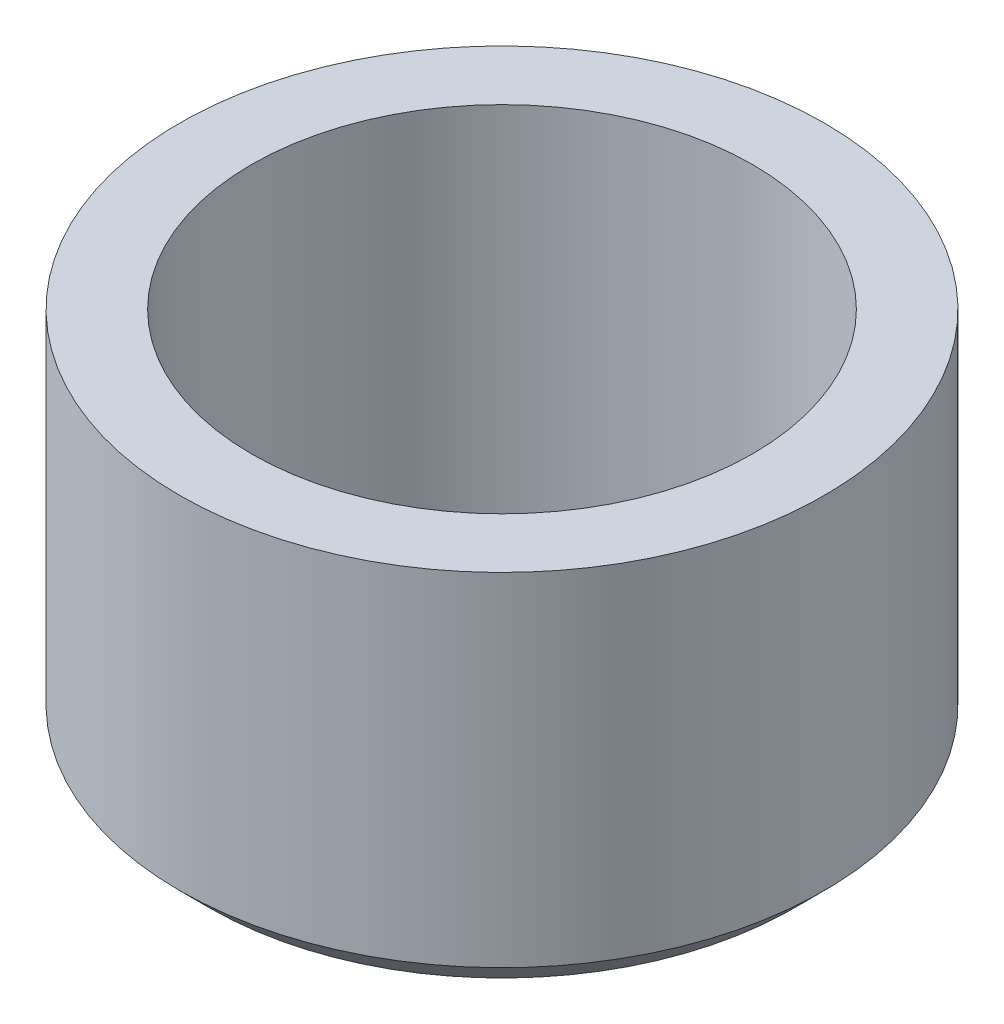
ISO-10303-21;
HEADER;
FILE_DESCRIPTION(('STEP AP214'),'2;1');
FILE_NAME('part.step','',(''),(''),'','','');
FILE_SCHEMA(('AUTOMOTIVE_DESIGN { 1 0 10303 214 1 1 1 1 }'));
ENDSEC;
DATA;
#1=APPLICATION_CONTEXT('core data for automotive mechanical design processes');
#2=APPLICATION_PROTOCOL_DEFINITION('international standard','automotive_design',2000,#1);
#3=PRODUCT_CONTEXT('',#1,'mechanical');
#4=PRODUCT('Part','Part','',(#3));
#5=PRODUCT_RELATED_PRODUCT_CATEGORY('part','',(#4));
#6=PRODUCT_DEFINITION_FORMATION('','',#4);
#7=PRODUCT_DEFINITION_CONTEXT('part definition',#1,'design');
#8=PRODUCT_DEFINITION('design','',#6,#7);
#9=PRODUCT_DEFINITION_SHAPE('','',#8);
#10=(LENGTH_UNIT() NAMED_UNIT(*) SI_UNIT(.MILLI.,.METRE.));
#11=(NAMED_UNIT(*) PLANE_ANGLE_UNIT() SI_UNIT($,.RADIAN.));
#12=(NAMED_UNIT(*) SI_UNIT($,.STERADIAN.) SOLID_ANGLE_UNIT());
#13=UNCERTAINTY_MEASURE_WITH_UNIT(LENGTH_MEASURE(1.E-05),#10,'distance_accuracy_value','');
#14=(GEOMETRIC_REPRESENTATION_CONTEXT(3) GLOBAL_UNCERTAINTY_ASSIGNED_CONTEXT((#13)) GLOBAL_UNIT_ASSIGNED_CONTEXT((#10,
#11,#12)) REPRESENTATION_CONTEXT('',''));
#15=CARTESIAN_POINT('',(0.,0.,0.));
#16=DIRECTION('',(0.,0.,1.));
#17=DIRECTION('',(1.,0.,0.));
#18=AXIS2_PLACEMENT_3D('',#15,#16,#17);
#19=CARTESIAN_POINT('',(-5.275,6.1,0.));
#20=DIRECTION('',(0.,1.,0.));
#21=DIRECTION('',(0.,0.,1.));
#22=AXIS2_PLACEMENT_3D('',#19,#20,#21);
#23=PLANE('',#22);
#24=CARTESIAN_POINT('',(0.,6.1,0.));
#25=DIRECTION('',(0.,1.,0.));
#26=DIRECTION('',(0.,0.,1.));
#27=AXIS2_PLACEMENT_3D('',#24,#25,#26);
#28=CIRCLE('',#27,5.275);
#29=CARTESIAN_POINT('',(0.,6.1,5.275));
#30=VERTEX_POINT('',#29);
#31=EDGE_CURVE('E56',#30,#30,#28,.T.);
#32=ORIENTED_EDGE('',*,*,#31,.T.);
#33=EDGE_LOOP('',(#32));
#34=FACE_BOUND('',#33,.T.);
#35=CARTESIAN_POINT('',(0.,6.1,0.));
#36=DIRECTION('',(0.,1.,0.));
#37=DIRECTION('',(0.,0.,1.));
#38=AXIS2_PLACEMENT_3D('',#35,#36,#37);
#39=CIRCLE('',#38,4.1);
#40=CARTESIAN_POINT('',(0.,6.1,4.1));
#41=VERTEX_POINT('',#40);
#42=EDGE_CURVE('E68',#41,#41,#39,.T.);
#43=ORIENTED_EDGE('',*,*,#42,.F.);
#44=EDGE_LOOP('',(#43));
#45=FACE_BOUND('',#44,.T.);
#46=ADVANCED_FACE('F41',(#34,#45),#23,.T.);
#47=CARTESIAN_POINT('',(0.,36.0573770491804,0.));
#48=DIRECTION('',(0.,1.,0.));
#49=DIRECTION('',(0.,0.,1.));
#50=AXIS2_PLACEMENT_3D('',#47,#48,#49);
#51=CYLINDRICAL_SURFACE('',#50,5.275);
#52=CARTESIAN_POINT('',(0.,0.5,0.));
#53=DIRECTION('',(0.,-1.,0.));
#54=DIRECTION('',(0.,0.,-1.));
#55=AXIS2_PLACEMENT_3D('',#52,#53,#54);
#56=CIRCLE('',#55,5.275);
#57=CARTESIAN_POINT('',(0.,0.5,-5.275));
#58=VERTEX_POINT('',#57);
#59=EDGE_CURVE('E49',#58,#58,#56,.F.);
#60=ORIENTED_EDGE('',*,*,#59,.T.);
#61=EDGE_LOOP('',(#60));
#62=FACE_BOUND('',#61,.T.);
#63=ORIENTED_EDGE('',*,*,#31,.F.);
#64=EDGE_LOOP('',(#63));
#65=FACE_BOUND('',#64,.T.);
#66=ADVANCED_FACE('F77',(#62,#65),#51,.T.);
#67=CARTESIAN_POINT('',(-5.275,0.,0.));
#68=DIRECTION('',(0.,-1.,0.));
#69=DIRECTION('',(0.,0.,-1.));
#70=AXIS2_PLACEMENT_3D('',#67,#68,#69);
#71=PLANE('',#70);
#72=CARTESIAN_POINT('',(0.,0.,0.));
#73=DIRECTION('',(0.,-1.,0.));
#74=DIRECTION('',(0.,0.,-1.));
#75=AXIS2_PLACEMENT_3D('',#72,#73,#74);
#76=CIRCLE('',#75,4.775);
#77=CARTESIAN_POINT('',(0.,0.,-4.775));
#78=VERTEX_POINT('',#77);
#79=EDGE_CURVE('E10',#78,#78,#76,.T.);
#80=ORIENTED_EDGE('',*,*,#79,.T.);
#81=EDGE_LOOP('',(#80));
#82=FACE_BOUND('',#81,.T.);
#83=CARTESIAN_POINT('',(0.,0.,0.));
#84=DIRECTION('',(0.,1.,0.));
#85=DIRECTION('',(0.,0.,1.));
#86=AXIS2_PLACEMENT_3D('',#83,#84,#85);
#87=CIRCLE('',#86,4.1);
#88=CARTESIAN_POINT('',(0.,0.,4.1));
#89=VERTEX_POINT('',#88);
#90=EDGE_CURVE('E63',#89,#89,#87,.T.);
#91=ORIENTED_EDGE('',*,*,#90,.T.);
#92=EDGE_LOOP('',(#91));
#93=FACE_BOUND('',#92,.T.);
#94=ADVANCED_FACE('F82',(#82,#93),#71,.T.);
#95=CARTESIAN_POINT('',(0.,36.0573770491804,0.));
#96=DIRECTION('',(0.,1.,0.));
#97=DIRECTION('',(0.,0.,1.));
#98=AXIS2_PLACEMENT_3D('',#95,#96,#97);
#99=CYLINDRICAL_SURFACE('',#98,4.1);
#100=ORIENTED_EDGE('',*,*,#42,.T.);
#101=EDGE_LOOP('',(#100));
#102=FACE_BOUND('',#101,.T.);
#103=ORIENTED_EDGE('',*,*,#90,.F.);
#104=EDGE_LOOP('',(#103));
#105=FACE_BOUND('',#104,.T.);
#106=ADVANCED_FACE('F73',(#102,#105),#99,.F.);
#107=CARTESIAN_POINT('',(0.,0.5,0.));
#108=DIRECTION('',(0.,1.,0.));
#109=DIRECTION('',(0.,0.,1.));
#110=AXIS2_PLACEMENT_3D('',#107,#108,#109);
#111=CONICAL_SURFACE('',#110,5.275,0.785398163397449);
#112=ORIENTED_EDGE('',*,*,#79,.F.);
#113=EDGE_LOOP('',(#112));
#114=FACE_BOUND('',#113,.T.);
#115=ORIENTED_EDGE('',*,*,#59,.F.);
#116=EDGE_LOOP('',(#115));
#117=FACE_BOUND('',#116,.T.);
#118=ADVANCED_FACE('F43',(#114,#117),#111,.T.);
#119=CLOSED_SHELL('',(#46,#66,#94,#106,#118));
#120=MANIFOLD_SOLID_BREP('B2',#119);
#121=ADVANCED_BREP_SHAPE_REPRESENTATION('',(#18,#120),#14);
#122=SHAPE_DEFINITION_REPRESENTATION(#9,#121);
ENDSEC;
END-ISO-10303-21;
